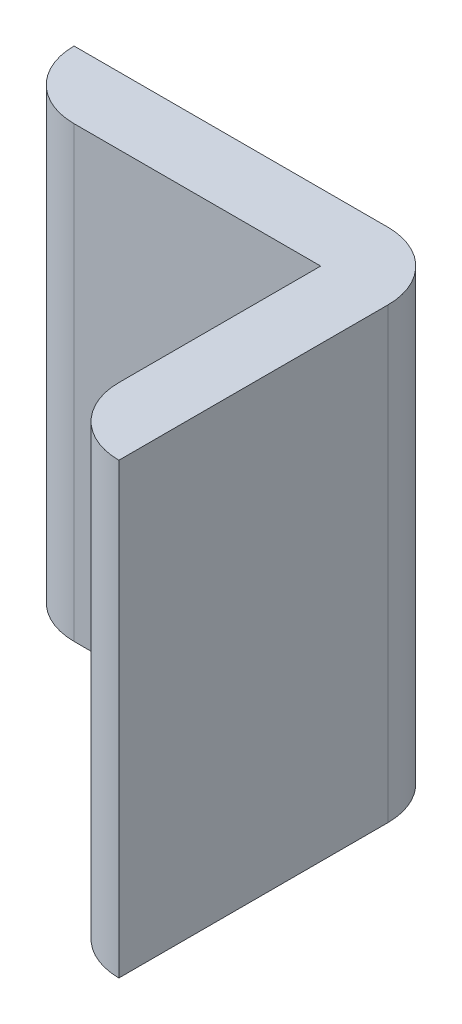
ISO-10303-21;
HEADER;
FILE_DESCRIPTION(('STEP AP214'),'2;1');
FILE_NAME('part.step','',(''),(''),'','','');
FILE_SCHEMA(('AUTOMOTIVE_DESIGN { 1 0 10303 214 1 1 1 1 }'));
ENDSEC;
DATA;
#1=APPLICATION_CONTEXT('core data for automotive mechanical design processes');
#2=APPLICATION_PROTOCOL_DEFINITION('international standard','automotive_design',2000,#1);
#3=PRODUCT_CONTEXT('',#1,'mechanical');
#4=PRODUCT('Part','Part','',(#3));
#5=PRODUCT_RELATED_PRODUCT_CATEGORY('part','',(#4));
#6=PRODUCT_DEFINITION_FORMATION('','',#4);
#7=PRODUCT_DEFINITION_CONTEXT('part definition',#1,'design');
#8=PRODUCT_DEFINITION('design','',#6,#7);
#9=PRODUCT_DEFINITION_SHAPE('','',#8);
#10=(LENGTH_UNIT() NAMED_UNIT(*) SI_UNIT(.MILLI.,.METRE.));
#11=(NAMED_UNIT(*) PLANE_ANGLE_UNIT() SI_UNIT($,.RADIAN.));
#12=(NAMED_UNIT(*) SI_UNIT($,.STERADIAN.) SOLID_ANGLE_UNIT());
#13=UNCERTAINTY_MEASURE_WITH_UNIT(LENGTH_MEASURE(1.E-05),#10,'distance_accuracy_value','');
#14=(GEOMETRIC_REPRESENTATION_CONTEXT(3) GLOBAL_UNCERTAINTY_ASSIGNED_CONTEXT((#13)) GLOBAL_UNIT_ASSIGNED_CONTEXT((#10,
#11,#12)) REPRESENTATION_CONTEXT('',''));
#15=CARTESIAN_POINT('',(0.,0.,0.));
#16=DIRECTION('',(0.,0.,1.));
#17=DIRECTION('',(1.,0.,0.));
#18=AXIS2_PLACEMENT_3D('',#15,#16,#17);
#19=CARTESIAN_POINT('',(2.2733,-0.254,0.381));
#20=DIRECTION('',(-1.,0.,0.));
#21=DIRECTION('',(0.,0.,1.));
#22=AXIS2_PLACEMENT_3D('',#19,#20,#21);
#23=PLANE('',#22);
#24=DIRECTION('',(0.,0.,-1.));
#25=VECTOR('',#24,1.);
#26=CARTESIAN_POINT('',(2.2733,-0.254,0.));
#27=LINE('',#26,#25);
#28=CARTESIAN_POINT('',(2.2733,-0.254,0.0762));
#29=VERTEX_POINT('',#28);
#30=CARTESIAN_POINT('',(2.2733,-0.254,0.381));
#31=VERTEX_POINT('',#30);
#32=EDGE_CURVE('E128',#29,#31,#27,.F.);
#33=ORIENTED_EDGE('',*,*,#32,.F.);
#34=DIRECTION('',(0.,-1.,0.));
#35=VECTOR('',#34,1.);
#36=CARTESIAN_POINT('',(2.2733,-0.254,0.0762));
#37=LINE('',#36,#35);
#38=CARTESIAN_POINT('',(2.2733,0.254,0.0762));
#39=VERTEX_POINT('',#38);
#40=EDGE_CURVE('E81',#39,#29,#37,.T.);
#41=ORIENTED_EDGE('',*,*,#40,.F.);
#42=DIRECTION('',(0.,0.,-1.));
#43=VECTOR('',#42,1.);
#44=CARTESIAN_POINT('',(2.2733,0.254,0.));
#45=LINE('',#44,#43);
#46=CARTESIAN_POINT('',(2.2733,0.254,0.381));
#47=VERTEX_POINT('',#46);
#48=EDGE_CURVE('E76',#39,#47,#45,.F.);
#49=ORIENTED_EDGE('',*,*,#48,.T.);
#50=DIRECTION('',(0.,-1.,0.));
#51=VECTOR('',#50,1.);
#52=CARTESIAN_POINT('',(2.2733,-0.254,0.381));
#53=LINE('',#52,#51);
#54=EDGE_CURVE('E122',#31,#47,#53,.F.);
#55=ORIENTED_EDGE('',*,*,#54,.F.);
#56=EDGE_LOOP('',(#33,#41,#49,#55));
#57=FACE_BOUND('',#56,.T.);
#58=ADVANCED_FACE('F16',(#57),#23,.F.);
#59=CARTESIAN_POINT('',(2.2733,-0.254,0.3048));
#60=DIRECTION('',(0.,-1.,0.));
#61=DIRECTION('',(0.,0.,-1.));
#62=AXIS2_PLACEMENT_3D('',#59,#60,#61);
#63=CYLINDRICAL_SURFACE('',#62,0.0762);
#64=CARTESIAN_POINT('',(2.2733,0.254,0.3048));
#65=DIRECTION('',(0.,-1.,0.));
#66=DIRECTION('',(0.,0.,-1.));
#67=AXIS2_PLACEMENT_3D('',#64,#65,#66);
#68=CIRCLE('',#67,0.0762);
#69=CARTESIAN_POINT('',(2.1971,0.254,0.3048));
#70=VERTEX_POINT('',#69);
#71=EDGE_CURVE('E106',#47,#70,#68,.T.);
#72=ORIENTED_EDGE('',*,*,#71,.T.);
#73=DIRECTION('',(0.,1.,0.));
#74=VECTOR('',#73,1.);
#75=CARTESIAN_POINT('',(2.1971,-0.254,0.3048));
#76=LINE('',#75,#74);
#77=CARTESIAN_POINT('',(2.1971,-0.254,0.3048));
#78=VERTEX_POINT('',#77);
#79=EDGE_CURVE('E117',#70,#78,#76,.F.);
#80=ORIENTED_EDGE('',*,*,#79,.T.);
#81=CARTESIAN_POINT('',(2.2733,-0.254,0.3048));
#82=DIRECTION('',(0.,-1.,0.));
#83=DIRECTION('',(0.,0.,-1.));
#84=AXIS2_PLACEMENT_3D('',#81,#82,#83);
#85=CIRCLE('',#84,0.0762);
#86=EDGE_CURVE('E125',#31,#78,#85,.T.);
#87=ORIENTED_EDGE('',*,*,#86,.F.);
#88=ORIENTED_EDGE('',*,*,#54,.T.);
#89=EDGE_LOOP('',(#72,#80,#87,#88));
#90=FACE_BOUND('',#89,.T.);
#91=ADVANCED_FACE('F132',(#90),#63,.T.);
#92=CARTESIAN_POINT('',(2.1971,-0.254,0.0762));
#93=DIRECTION('',(1.,0.,0.));
#94=DIRECTION('',(0.,0.,-1.));
#95=AXIS2_PLACEMENT_3D('',#92,#93,#94);
#96=PLANE('',#95);
#97=ORIENTED_EDGE('',*,*,#79,.F.);
#98=DIRECTION('',(0.,0.,-1.));
#99=VECTOR('',#98,1.);
#100=CARTESIAN_POINT('',(2.1971,0.254,0.));
#101=LINE('',#100,#99);
#102=CARTESIAN_POINT('',(2.1971,0.254,0.0762));
#103=VERTEX_POINT('',#102);
#104=EDGE_CURVE('E101',#70,#103,#101,.T.);
#105=ORIENTED_EDGE('',*,*,#104,.T.);
#106=DIRECTION('',(0.,1.,0.));
#107=VECTOR('',#106,1.);
#108=CARTESIAN_POINT('',(2.1971,-0.254,0.0762));
#109=LINE('',#108,#107);
#110=CARTESIAN_POINT('',(2.1971,-0.254,0.0762));
#111=VERTEX_POINT('',#110);
#112=EDGE_CURVE('E114',#103,#111,#109,.F.);
#113=ORIENTED_EDGE('',*,*,#112,.T.);
#114=DIRECTION('',(0.,0.,-1.));
#115=VECTOR('',#114,1.);
#116=CARTESIAN_POINT('',(2.1971,-0.254,0.));
#117=LINE('',#116,#115);
#118=EDGE_CURVE('E127',#78,#111,#117,.T.);
#119=ORIENTED_EDGE('',*,*,#118,.F.);
#120=EDGE_LOOP('',(#97,#105,#113,#119));
#121=FACE_BOUND('',#120,.T.);
#122=ADVANCED_FACE('F157',(#121),#96,.F.);
#123=CARTESIAN_POINT('',(1.9177,-0.254,0.0762));
#124=DIRECTION('',(0.,0.,-1.));
#125=DIRECTION('',(-1.,0.,0.));
#126=AXIS2_PLACEMENT_3D('',#123,#124,#125);
#127=PLANE('',#126);
#128=ORIENTED_EDGE('',*,*,#112,.F.);
#129=DIRECTION('',(1.,0.,0.));
#130=VECTOR('',#129,1.);
#131=CARTESIAN_POINT('',(1.8415,0.254,0.0762));
#132=LINE('',#131,#130);
#133=CARTESIAN_POINT('',(1.9177,0.254,0.0762));
#134=VERTEX_POINT('',#133);
#135=EDGE_CURVE('E97',#103,#134,#132,.F.);
#136=ORIENTED_EDGE('',*,*,#135,.T.);
#137=DIRECTION('',(0.,-1.,0.));
#138=VECTOR('',#137,1.);
#139=CARTESIAN_POINT('',(1.9177,-0.254,0.0762));
#140=LINE('',#139,#138);
#141=CARTESIAN_POINT('',(1.9177,-0.254,0.0762));
#142=VERTEX_POINT('',#141);
#143=EDGE_CURVE('E100',#142,#134,#140,.F.);
#144=ORIENTED_EDGE('',*,*,#143,.F.);
#145=DIRECTION('',(1.,0.,0.));
#146=VECTOR('',#145,1.);
#147=CARTESIAN_POINT('',(1.8415,-0.254,0.0762));
#148=LINE('',#147,#146);
#149=EDGE_CURVE('E93',#111,#142,#148,.F.);
#150=ORIENTED_EDGE('',*,*,#149,.F.);
#151=EDGE_LOOP('',(#128,#136,#144,#150));
#152=FACE_BOUND('',#151,.T.);
#153=ADVANCED_FACE('F155',(#152),#127,.F.);
#154=CARTESIAN_POINT('',(2.1971,-0.254,0.0762));
#155=DIRECTION('',(0.,-1.,0.));
#156=DIRECTION('',(0.,0.,-1.));
#157=AXIS2_PLACEMENT_3D('',#154,#155,#156);
#158=CYLINDRICAL_SURFACE('',#157,0.0762);
#159=CARTESIAN_POINT('',(2.1971,0.254,0.0762));
#160=DIRECTION('',(0.,-1.,0.));
#161=DIRECTION('',(0.,0.,-1.));
#162=AXIS2_PLACEMENT_3D('',#159,#160,#161);
#163=CIRCLE('',#162,0.0762);
#164=CARTESIAN_POINT('',(2.1971,0.254,0.));
#165=VERTEX_POINT('',#164);
#166=EDGE_CURVE('E19',#165,#39,#163,.T.);
#167=ORIENTED_EDGE('',*,*,#166,.T.);
#168=ORIENTED_EDGE('',*,*,#40,.T.);
#169=CARTESIAN_POINT('',(2.1971,-0.254,0.0762));
#170=DIRECTION('',(0.,-1.,0.));
#171=DIRECTION('',(0.,0.,-1.));
#172=AXIS2_PLACEMENT_3D('',#169,#170,#171);
#173=CIRCLE('',#172,0.0762);
#174=CARTESIAN_POINT('',(2.1971,-0.254,0.));
#175=VERTEX_POINT('',#174);
#176=EDGE_CURVE('E91',#175,#29,#173,.T.);
#177=ORIENTED_EDGE('',*,*,#176,.F.);
#178=DIRECTION('',(0.,1.,0.));
#179=VECTOR('',#178,1.);
#180=CARTESIAN_POINT('',(2.1971,-0.254,0.));
#181=LINE('',#180,#179);
#182=EDGE_CURVE('E85',#175,#165,#181,.T.);
#183=ORIENTED_EDGE('',*,*,#182,.T.);
#184=EDGE_LOOP('',(#167,#168,#177,#183));
#185=FACE_BOUND('',#184,.T.);
#186=ADVANCED_FACE('F89',(#185),#158,.T.);
#187=CARTESIAN_POINT('',(1.8415,0.254,0.));
#188=DIRECTION('',(0.,-1.,0.));
#189=DIRECTION('',(0.,0.,-1.));
#190=AXIS2_PLACEMENT_3D('',#187,#188,#189);
#191=PLANE('',#190);
#192=ORIENTED_EDGE('',*,*,#135,.F.);
#193=ORIENTED_EDGE('',*,*,#104,.F.);
#194=ORIENTED_EDGE('',*,*,#71,.F.);
#195=ORIENTED_EDGE('',*,*,#48,.F.);
#196=ORIENTED_EDGE('',*,*,#166,.F.);
#197=DIRECTION('',(1.,0.,0.));
#198=VECTOR('',#197,1.);
#199=CARTESIAN_POINT('',(2.1971,0.254,0.));
#200=LINE('',#199,#198);
#201=CARTESIAN_POINT('',(1.8415,0.254,0.));
#202=VERTEX_POINT('',#201);
#203=EDGE_CURVE('E73',#165,#202,#200,.F.);
#204=ORIENTED_EDGE('',*,*,#203,.T.);
#205=CARTESIAN_POINT('',(1.9177,0.254,0.));
#206=DIRECTION('',(0.,-1.,0.));
#207=DIRECTION('',(0.,0.,-1.));
#208=AXIS2_PLACEMENT_3D('',#205,#206,#207);
#209=CIRCLE('',#208,0.0762);
#210=EDGE_CURVE('E113',#134,#202,#209,.T.);
#211=ORIENTED_EDGE('',*,*,#210,.F.);
#212=EDGE_LOOP('',(#192,#193,#194,#195,#196,#204,#211));
#213=FACE_BOUND('',#212,.T.);
#214=ADVANCED_FACE('F71',(#213),#191,.F.);
#215=CARTESIAN_POINT('',(1.9177,-0.254,0.));
#216=DIRECTION('',(0.,-1.,0.));
#217=DIRECTION('',(0.,0.,-1.));
#218=AXIS2_PLACEMENT_3D('',#215,#216,#217);
#219=CYLINDRICAL_SURFACE('',#218,0.0762);
#220=ORIENTED_EDGE('',*,*,#210,.T.);
#221=DIRECTION('',(0.,1.,0.));
#222=VECTOR('',#221,1.);
#223=CARTESIAN_POINT('',(1.8415,-0.254,0.));
#224=LINE('',#223,#222);
#225=CARTESIAN_POINT('',(1.8415,-0.254,0.));
#226=VERTEX_POINT('',#225);
#227=EDGE_CURVE('E25',#202,#226,#224,.F.);
#228=ORIENTED_EDGE('',*,*,#227,.T.);
#229=CARTESIAN_POINT('',(1.9177,-0.254,0.));
#230=DIRECTION('',(0.,-1.,0.));
#231=DIRECTION('',(0.,0.,-1.));
#232=AXIS2_PLACEMENT_3D('',#229,#230,#231);
#233=CIRCLE('',#232,0.0762);
#234=EDGE_CURVE('E33',#142,#226,#233,.T.);
#235=ORIENTED_EDGE('',*,*,#234,.F.);
#236=ORIENTED_EDGE('',*,*,#143,.T.);
#237=EDGE_LOOP('',(#220,#228,#235,#236));
#238=FACE_BOUND('',#237,.T.);
#239=ADVANCED_FACE('F140',(#238),#219,.T.);
#240=CARTESIAN_POINT('',(1.8415,-0.254,0.));
#241=DIRECTION('',(0.,-1.,0.));
#242=DIRECTION('',(0.,0.,-1.));
#243=AXIS2_PLACEMENT_3D('',#240,#241,#242);
#244=PLANE('',#243);
#245=ORIENTED_EDGE('',*,*,#149,.T.);
#246=ORIENTED_EDGE('',*,*,#234,.T.);
#247=DIRECTION('',(1.,0.,0.));
#248=VECTOR('',#247,1.);
#249=CARTESIAN_POINT('',(2.1971,-0.254,0.));
#250=LINE('',#249,#248);
#251=EDGE_CURVE('E11',#226,#175,#250,.T.);
#252=ORIENTED_EDGE('',*,*,#251,.T.);
#253=ORIENTED_EDGE('',*,*,#176,.T.);
#254=ORIENTED_EDGE('',*,*,#32,.T.);
#255=ORIENTED_EDGE('',*,*,#86,.T.);
#256=ORIENTED_EDGE('',*,*,#118,.T.);
#257=EDGE_LOOP('',(#245,#246,#252,#253,#254,#255,#256));
#258=FACE_BOUND('',#257,.T.);
#259=ADVANCED_FACE('F138',(#258),#244,.T.);
#260=CARTESIAN_POINT('',(2.1971,-0.254,0.));
#261=DIRECTION('',(0.,0.,1.));
#262=DIRECTION('',(1.,0.,0.));
#263=AXIS2_PLACEMENT_3D('',#260,#261,#262);
#264=PLANE('',#263);
#265=ORIENTED_EDGE('',*,*,#227,.F.);
#266=ORIENTED_EDGE('',*,*,#203,.F.);
#267=ORIENTED_EDGE('',*,*,#182,.F.);
#268=ORIENTED_EDGE('',*,*,#251,.F.);
#269=EDGE_LOOP('',(#265,#266,#267,#268));
#270=FACE_BOUND('',#269,.T.);
#271=ADVANCED_FACE('F84',(#270),#264,.F.);
#272=CLOSED_SHELL('',(#58,#91,#122,#153,#186,#214,#239,#259,#271));
#273=MANIFOLD_SOLID_BREP('B1',#272);
#274=ADVANCED_BREP_SHAPE_REPRESENTATION('',(#18,#273),#14);
#275=SHAPE_DEFINITION_REPRESENTATION(#9,#274);
ENDSEC;
END-ISO-10303-21;
